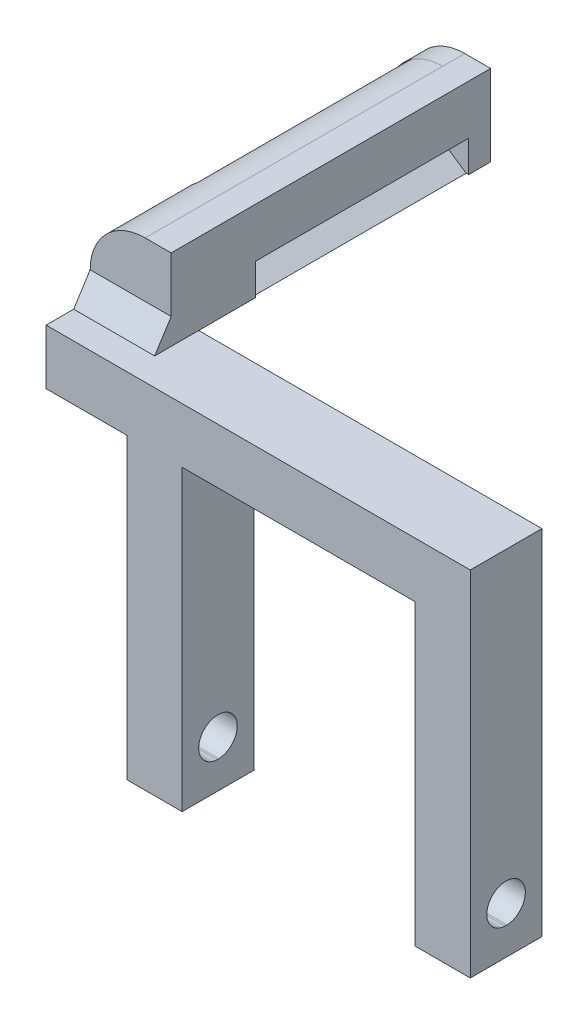
ISO-10303-21;
HEADER;
FILE_DESCRIPTION(('STEP AP214'),'2;1');
FILE_NAME('part.step','',(''),(''),'','','');
FILE_SCHEMA(('AUTOMOTIVE_DESIGN { 1 0 10303 214 1 1 1 1 }'));
ENDSEC;
DATA;
#1=APPLICATION_CONTEXT('core data for automotive mechanical design processes');
#2=APPLICATION_PROTOCOL_DEFINITION('international standard','automotive_design',2000,#1);
#3=PRODUCT_CONTEXT('',#1,'mechanical');
#4=PRODUCT('Part','Part','',(#3));
#5=PRODUCT_RELATED_PRODUCT_CATEGORY('part','',(#4));
#6=PRODUCT_DEFINITION_FORMATION('','',#4);
#7=PRODUCT_DEFINITION_CONTEXT('part definition',#1,'design');
#8=PRODUCT_DEFINITION('design','',#6,#7);
#9=PRODUCT_DEFINITION_SHAPE('','',#8);
#10=(LENGTH_UNIT() NAMED_UNIT(*) SI_UNIT(.MILLI.,.METRE.));
#11=(NAMED_UNIT(*) PLANE_ANGLE_UNIT() SI_UNIT($,.RADIAN.));
#12=(NAMED_UNIT(*) SI_UNIT($,.STERADIAN.) SOLID_ANGLE_UNIT());
#13=UNCERTAINTY_MEASURE_WITH_UNIT(LENGTH_MEASURE(1.E-05),#10,'distance_accuracy_value','');
#14=(GEOMETRIC_REPRESENTATION_CONTEXT(3) GLOBAL_UNCERTAINTY_ASSIGNED_CONTEXT((#13)) GLOBAL_UNIT_ASSIGNED_CONTEXT((#10,
#11,#12)) REPRESENTATION_CONTEXT('',''));
#15=CARTESIAN_POINT('',(0.,0.,0.));
#16=DIRECTION('',(0.,0.,1.));
#17=DIRECTION('',(1.,0.,0.));
#18=AXIS2_PLACEMENT_3D('',#15,#16,#17);
#19=CARTESIAN_POINT('',(-21.5,10.,5.));
#20=DIRECTION('',(0.,0.,-1.));
#21=DIRECTION('',(-1.,0.,0.));
#22=AXIS2_PLACEMENT_3D('',#19,#20,#21);
#23=PLANE('',#22);
#24=CARTESIAN_POINT('',(-36.2,14.7,5.));
#25=DIRECTION('',(0.,0.,-1.));
#26=DIRECTION('',(-1.,0.,0.));
#27=AXIS2_PLACEMENT_3D('',#24,#25,#26);
#28=CIRCLE('',#27,10.);
#29=CARTESIAN_POINT('',(-36.2,24.7,5.));
#30=VERTEX_POINT('',#29);
#31=CARTESIAN_POINT('',(-46.2,14.7,5.));
#32=VERTEX_POINT('',#31);
#33=EDGE_CURVE('E395',#30,#32,#28,.F.);
#34=ORIENTED_EDGE('',*,*,#33,.T.);
#35=DIRECTION('',(-1.,0.,0.));
#36=VECTOR('',#35,1.);
#37=CARTESIAN_POINT('',(-31.2,14.7,5.));
#38=LINE('',#37,#36);
#39=CARTESIAN_POINT('',(-31.5,14.7,5.));
#40=VERTEX_POINT('',#39);
#41=EDGE_CURVE('E304',#40,#32,#38,.T.);
#42=ORIENTED_EDGE('',*,*,#41,.F.);
#43=DIRECTION('',(0.,-1.,0.));
#44=VECTOR('',#43,1.);
#45=CARTESIAN_POINT('',(-31.5,24.7,5.));
#46=LINE('',#45,#44);
#47=CARTESIAN_POINT('',(-31.5,24.7,5.));
#48=VERTEX_POINT('',#47);
#49=EDGE_CURVE('E384',#48,#40,#46,.T.);
#50=ORIENTED_EDGE('',*,*,#49,.F.);
#51=DIRECTION('',(1.,0.,0.));
#52=VECTOR('',#51,1.);
#53=CARTESIAN_POINT('',(-46.2,24.7,5.));
#54=LINE('',#53,#52);
#55=EDGE_CURVE('E379',#30,#48,#54,.T.);
#56=ORIENTED_EDGE('',*,*,#55,.F.);
#57=EDGE_LOOP('',(#34,#42,#50,#56));
#58=FACE_BOUND('',#57,.T.);
#59=ADVANCED_FACE('F33',(#58),#23,.F.);
#60=CARTESIAN_POINT('',(0.,0.,0.));
#61=DIRECTION('',(0.,1.,0.));
#62=DIRECTION('',(0.,0.,1.));
#63=AXIS2_PLACEMENT_3D('',#60,#61,#62);
#64=PLANE('',#63);
#65=DIRECTION('',(0.,0.,1.));
#66=VECTOR('',#65,1.);
#67=CARTESIAN_POINT('',(-21.5,0.,-5.));
#68=LINE('',#67,#66);
#69=CARTESIAN_POINT('',(-21.5,0.,0.));
#70=VERTEX_POINT('',#69);
#71=CARTESIAN_POINT('',(-21.5,0.,13.));
#72=VERTEX_POINT('',#71);
#73=EDGE_CURVE('E215',#70,#72,#68,.T.);
#74=ORIENTED_EDGE('',*,*,#73,.F.);
#75=DIRECTION('',(1.,0.,0.));
#76=VECTOR('',#75,1.);
#77=CARTESIAN_POINT('',(0.,0.,0.));
#78=LINE('',#77,#76);
#79=CARTESIAN_POINT('',(20.8,0.,0.));
#80=VERTEX_POINT('',#79);
#81=EDGE_CURVE('E313',#70,#80,#78,.T.);
#82=ORIENTED_EDGE('',*,*,#81,.T.);
#83=DIRECTION('',(0.,0.,-1.));
#84=VECTOR('',#83,1.);
#85=CARTESIAN_POINT('',(20.8,0.,-5.));
#86=LINE('',#85,#84);
#87=CARTESIAN_POINT('',(20.8,0.,13.));
#88=VERTEX_POINT('',#87);
#89=EDGE_CURVE('E326',#88,#80,#86,.T.);
#90=ORIENTED_EDGE('',*,*,#89,.F.);
#91=DIRECTION('',(1.,0.,0.));
#92=VECTOR('',#91,1.);
#93=CARTESIAN_POINT('',(-21.5,0.,13.));
#94=LINE('',#93,#92);
#95=EDGE_CURVE('E219',#72,#88,#94,.T.);
#96=ORIENTED_EDGE('',*,*,#95,.F.);
#97=EDGE_LOOP('',(#74,#82,#90,#96));
#98=FACE_BOUND('',#97,.T.);
#99=ADVANCED_FACE('F449',(#98),#64,.F.);
#100=CARTESIAN_POINT('',(-31.5,24.7,-5.));
#101=DIRECTION('',(-1.,0.,0.));
#102=DIRECTION('',(0.,0.,1.));
#103=AXIS2_PLACEMENT_3D('',#100,#101,#102);
#104=PLANE('',#103);
#105=DIRECTION('',(0.,0.,1.));
#106=VECTOR('',#105,1.);
#107=CARTESIAN_POINT('',(-31.5,15.7251090794089,-5.));
#108=LINE('',#107,#106);
#109=CARTESIAN_POINT('',(-31.5,15.7251090794089,-49.));
#110=VERTEX_POINT('',#109);
#111=CARTESIAN_POINT('',(-31.5,15.7251090794089,-10.3));
#112=VERTEX_POINT('',#111);
#113=EDGE_CURVE('E340',#110,#112,#108,.T.);
#114=ORIENTED_EDGE('',*,*,#113,.F.);
#115=DIRECTION('',(0.,-1.,0.));
#116=VECTOR('',#115,1.);
#117=CARTESIAN_POINT('',(-31.5,24.7,-49.));
#118=LINE('',#117,#116);
#119=CARTESIAN_POINT('',(-31.5,10.,-49.));
#120=VERTEX_POINT('',#119);
#121=EDGE_CURVE('E343',#110,#120,#118,.T.);
#122=ORIENTED_EDGE('',*,*,#121,.T.);
#123=DIRECTION('',(0.,0.,1.));
#124=VECTOR('',#123,1.);
#125=CARTESIAN_POINT('',(-31.5,10.,-53.));
#126=LINE('',#125,#124);
#127=CARTESIAN_POINT('',(-31.5,10.,-53.));
#128=VERTEX_POINT('',#127);
#129=EDGE_CURVE('E354',#128,#120,#126,.T.);
#130=ORIENTED_EDGE('',*,*,#129,.F.);
#131=DIRECTION('',(0.,-1.,0.));
#132=VECTOR('',#131,1.);
#133=CARTESIAN_POINT('',(-31.5,24.7,-53.));
#134=LINE('',#133,#132);
#135=CARTESIAN_POINT('',(-31.5,24.7,-53.));
#136=VERTEX_POINT('',#135);
#137=EDGE_CURVE('E346',#136,#128,#134,.T.);
#138=ORIENTED_EDGE('',*,*,#137,.F.);
#139=DIRECTION('',(0.,0.,-1.));
#140=VECTOR('',#139,1.);
#141=CARTESIAN_POINT('',(-31.5,24.7,-5.));
#142=LINE('',#141,#140);
#143=EDGE_CURVE('E381',#48,#136,#142,.T.);
#144=ORIENTED_EDGE('',*,*,#143,.F.);
#145=ORIENTED_EDGE('',*,*,#49,.T.);
#146=DIRECTION('',(0.,-0.842922209577588,0.538035452921865));
#147=VECTOR('',#146,1.);
#148=CARTESIAN_POINT('',(-31.5,14.7,5.));
#149=LINE('',#148,#147);
#150=CARTESIAN_POINT('',(-31.5,10.,8.));
#151=VERTEX_POINT('',#150);
#152=EDGE_CURVE('E413',#40,#151,#149,.T.);
#153=ORIENTED_EDGE('',*,*,#152,.T.);
#154=DIRECTION('',(0.,0.,-1.));
#155=VECTOR('',#154,1.);
#156=CARTESIAN_POINT('',(-31.5,10.,-5.));
#157=LINE('',#156,#155);
#158=CARTESIAN_POINT('',(-31.5,10.,0.));
#159=VERTEX_POINT('',#158);
#160=EDGE_CURVE('E378',#151,#159,#157,.T.);
#161=ORIENTED_EDGE('',*,*,#160,.T.);
#162=DIRECTION('',(0.,0.,1.));
#163=VECTOR('',#162,1.);
#164=CARTESIAN_POINT('',(-31.5,10.,-19.7));
#165=LINE('',#164,#163);
#166=CARTESIAN_POINT('',(-31.5,10.,-10.3));
#167=VERTEX_POINT('',#166);
#168=EDGE_CURVE('E376',#167,#159,#165,.T.);
#169=ORIENTED_EDGE('',*,*,#168,.F.);
#170=DIRECTION('',(0.,-1.,0.));
#171=VECTOR('',#170,1.);
#172=CARTESIAN_POINT('',(-31.5,9.88,-10.3));
#173=LINE('',#172,#171);
#174=EDGE_CURVE('E369',#112,#167,#173,.T.);
#175=ORIENTED_EDGE('',*,*,#174,.F.);
#176=EDGE_LOOP('',(#114,#122,#130,#138,#144,#145,#153,#161,#169,#175));
#177=FACE_BOUND('',#176,.T.);
#178=ADVANCED_FACE('F455',(#177),#104,.F.);
#179=CARTESIAN_POINT('',(-36.2,14.7,0.));
#180=DIRECTION('',(0.,0.,1.));
#181=DIRECTION('',(1.,0.,0.));
#182=AXIS2_PLACEMENT_3D('',#179,#180,#181);
#183=CYLINDRICAL_SURFACE('',#182,10.);
#184=DIRECTION('',(0.,0.,1.));
#185=VECTOR('',#184,1.);
#186=CARTESIAN_POINT('',(-42.0560346654774,22.8059766837024,0.));
#187=LINE('',#186,#185);
#188=CARTESIAN_POINT('',(-42.0560346654774,22.8059766837024,-49.));
#189=VERTEX_POINT('',#188);
#190=CARTESIAN_POINT('',(-42.0560346654774,22.8059766837024,-10.3));
#191=VERTEX_POINT('',#190);
#192=EDGE_CURVE('E337',#189,#191,#187,.T.);
#193=ORIENTED_EDGE('',*,*,#192,.T.);
#194=CARTESIAN_POINT('',(-36.2,14.7,-10.3));
#195=DIRECTION('',(0.,0.,1.));
#196=DIRECTION('',(1.,0.,0.));
#197=AXIS2_PLACEMENT_3D('',#194,#195,#196);
#198=CIRCLE('',#197,10.);
#199=CARTESIAN_POINT('',(-45.2594042690637,18.9340517580292,-10.3));
#200=VERTEX_POINT('',#199);
#201=EDGE_CURVE('E364',#200,#191,#198,.F.);
#202=ORIENTED_EDGE('',*,*,#201,.F.);
#203=DIRECTION('',(0.,0.,1.));
#204=VECTOR('',#203,1.);
#205=CARTESIAN_POINT('',(-45.2594042690637,18.9340517580292,0.));
#206=LINE('',#205,#204);
#207=CARTESIAN_POINT('',(-45.2594042690637,18.9340517580292,-49.));
#208=VERTEX_POINT('',#207);
#209=EDGE_CURVE('E367',#208,#200,#206,.T.);
#210=ORIENTED_EDGE('',*,*,#209,.F.);
#211=CARTESIAN_POINT('',(-36.2,14.7,-49.));
#212=DIRECTION('',(0.,0.,-1.));
#213=DIRECTION('',(-1.,0.,0.));
#214=AXIS2_PLACEMENT_3D('',#211,#212,#213);
#215=CIRCLE('',#214,10.);
#216=CARTESIAN_POINT('',(-46.2,14.7,-49.));
#217=VERTEX_POINT('',#216);
#218=EDGE_CURVE('E401',#217,#208,#215,.T.);
#219=ORIENTED_EDGE('',*,*,#218,.F.);
#220=DIRECTION('',(0.,0.,1.));
#221=VECTOR('',#220,1.);
#222=CARTESIAN_POINT('',(-46.2,14.7,0.));
#223=LINE('',#222,#221);
#224=EDGE_CURVE('E398',#32,#217,#223,.F.);
#225=ORIENTED_EDGE('',*,*,#224,.F.);
#226=ORIENTED_EDGE('',*,*,#33,.F.);
#227=DIRECTION('',(0.,0.,1.));
#228=VECTOR('',#227,1.);
#229=CARTESIAN_POINT('',(-36.2,24.7,0.));
#230=LINE('',#229,#228);
#231=CARTESIAN_POINT('',(-36.2,24.7,-49.));
#232=VERTEX_POINT('',#231);
#233=EDGE_CURVE('E392',#232,#30,#230,.T.);
#234=ORIENTED_EDGE('',*,*,#233,.F.);
#235=EDGE_CURVE('E400',#189,#232,#215,.T.);
#236=ORIENTED_EDGE('',*,*,#235,.F.);
#237=EDGE_LOOP('',(#193,#202,#210,#219,#225,#226,#234,#236));
#238=FACE_BOUND('',#237,.T.);
#239=ADVANCED_FACE('F458',(#238),#183,.T.);
#240=CARTESIAN_POINT('',(-31.5,0.,0.));
#241=DIRECTION('',(1.,0.,0.));
#242=DIRECTION('',(0.,0.,-1.));
#243=AXIS2_PLACEMENT_3D('',#240,#241,#242);
#244=PLANE('',#243);
#245=DIRECTION('',(0.,-1.,0.));
#246=VECTOR('',#245,1.);
#247=CARTESIAN_POINT('',(-31.5,0.,0.));
#248=LINE('',#247,#246);
#249=CARTESIAN_POINT('',(-31.5,0.,0.));
#250=VERTEX_POINT('',#249);
#251=CARTESIAN_POINT('',(-31.5,-54.15,0.));
#252=VERTEX_POINT('',#251);
#253=EDGE_CURVE('E324',#250,#252,#248,.T.);
#254=ORIENTED_EDGE('',*,*,#253,.T.);
#255=DIRECTION('',(0.,0.,-1.));
#256=VECTOR('',#255,1.);
#257=CARTESIAN_POINT('',(-31.5,-54.15,13.));
#258=LINE('',#257,#256);
#259=CARTESIAN_POINT('',(-31.5,-54.15,13.));
#260=VERTEX_POINT('',#259);
#261=EDGE_CURVE('E231',#260,#252,#258,.T.);
#262=ORIENTED_EDGE('',*,*,#261,.F.);
#263=DIRECTION('',(0.,-1.,0.));
#264=VECTOR('',#263,1.);
#265=CARTESIAN_POINT('',(-31.5,0.,13.));
#266=LINE('',#265,#264);
#267=CARTESIAN_POINT('',(-31.5,0.,13.));
#268=VERTEX_POINT('',#267);
#269=EDGE_CURVE('E220',#268,#260,#266,.T.);
#270=ORIENTED_EDGE('',*,*,#269,.F.);
#271=DIRECTION('',(0.,0.,1.));
#272=VECTOR('',#271,1.);
#273=CARTESIAN_POINT('',(-31.5,0.,-5.));
#274=LINE('',#273,#272);
#275=EDGE_CURVE('E387',#250,#268,#274,.T.);
#276=ORIENTED_EDGE('',*,*,#275,.F.);
#277=EDGE_LOOP('',(#254,#262,#270,#276));
#278=FACE_BOUND('',#277,.T.);
#279=CARTESIAN_POINT('',(-31.5,-45.6537795556109,6.49999999999999));
#280=DIRECTION('',(1.,0.,0.));
#281=DIRECTION('',(0.,0.,-1.));
#282=AXIS2_PLACEMENT_3D('',#279,#280,#281);
#283=CIRCLE('',#282,3.5);
#284=CARTESIAN_POINT('',(-31.5,-49.15,6.66261182071307));
#285=VERTEX_POINT('',#284);
#286=CARTESIAN_POINT('',(-31.5,-49.15,6.33738817928692));
#287=VERTEX_POINT('',#286);
#288=EDGE_CURVE('E268',#285,#287,#283,.F.);
#289=ORIENTED_EDGE('',*,*,#288,.F.);
#290=DIRECTION('',(0.,0.,-1.));
#291=VECTOR('',#290,1.);
#292=CARTESIAN_POINT('',(-31.5,-49.15,13.));
#293=LINE('',#292,#291);
#294=EDGE_CURVE('E237',#285,#287,#293,.T.);
#295=ORIENTED_EDGE('',*,*,#294,.T.);
#296=EDGE_LOOP('',(#289,#295));
#297=FACE_BOUND('',#296,.T.);
#298=ADVANCED_FACE('F432',(#278,#297),#244,.F.);
#299=CARTESIAN_POINT('',(0.,10.,0.));
#300=DIRECTION('',(0.,1.,0.));
#301=DIRECTION('',(0.,0.,1.));
#302=AXIS2_PLACEMENT_3D('',#299,#300,#301);
#303=PLANE('',#302);
#304=ORIENTED_EDGE('',*,*,#160,.F.);
#305=DIRECTION('',(-1.,0.,0.));
#306=VECTOR('',#305,1.);
#307=CARTESIAN_POINT('',(-31.2,10.,8.));
#308=LINE('',#307,#306);
#309=CARTESIAN_POINT('',(-46.2,10.,8.));
#310=VERTEX_POINT('',#309);
#311=EDGE_CURVE('E303',#151,#310,#308,.T.);
#312=ORIENTED_EDGE('',*,*,#311,.T.);
#313=DIRECTION('',(0.,0.,-1.));
#314=VECTOR('',#313,1.);
#315=CARTESIAN_POINT('',(-46.2,10.,13.));
#316=LINE('',#315,#314);
#317=CARTESIAN_POINT('',(-46.2,10.,13.));
#318=VERTEX_POINT('',#317);
#319=EDGE_CURVE('E297',#318,#310,#316,.T.);
#320=ORIENTED_EDGE('',*,*,#319,.F.);
#321=DIRECTION('',(-1.,0.,0.));
#322=VECTOR('',#321,1.);
#323=CARTESIAN_POINT('',(30.8,10.,13.));
#324=LINE('',#323,#322);
#325=CARTESIAN_POINT('',(30.8,10.,13.));
#326=VERTEX_POINT('',#325);
#327=EDGE_CURVE('E283',#326,#318,#324,.T.);
#328=ORIENTED_EDGE('',*,*,#327,.F.);
#329=DIRECTION('',(0.,0.,1.));
#330=VECTOR('',#329,1.);
#331=CARTESIAN_POINT('',(30.8,10.,5.));
#332=LINE('',#331,#330);
#333=CARTESIAN_POINT('',(30.8,10.,0.));
#334=VERTEX_POINT('',#333);
#335=EDGE_CURVE('E329',#334,#326,#332,.T.);
#336=ORIENTED_EDGE('',*,*,#335,.F.);
#337=DIRECTION('',(1.,0.,0.));
#338=VECTOR('',#337,1.);
#339=CARTESIAN_POINT('',(-58.2,10.,0.));
#340=LINE('',#339,#338);
#341=EDGE_CURVE('E308',#159,#334,#340,.T.);
#342=ORIENTED_EDGE('',*,*,#341,.F.);
#343=EDGE_LOOP('',(#304,#312,#320,#328,#336,#342));
#344=FACE_BOUND('',#343,.T.);
#345=ADVANCED_FACE('F436',(#344),#303,.T.);
#346=CARTESIAN_POINT('',(-21.5,-43.18,-5.));
#347=DIRECTION('',(-1.,0.,0.));
#348=DIRECTION('',(0.,0.,1.));
#349=AXIS2_PLACEMENT_3D('',#346,#347,#348);
#350=PLANE('',#349);
#351=DIRECTION('',(0.,1.,0.));
#352=VECTOR('',#351,1.);
#353=CARTESIAN_POINT('',(-21.5,-49.15,13.));
#354=LINE('',#353,#352);
#355=CARTESIAN_POINT('',(-21.5,-54.15,13.));
#356=VERTEX_POINT('',#355);
#357=EDGE_CURVE('E207',#356,#72,#354,.T.);
#358=ORIENTED_EDGE('',*,*,#357,.F.);
#359=DIRECTION('',(0.,0.,1.));
#360=VECTOR('',#359,1.);
#361=CARTESIAN_POINT('',(-21.5,-54.15,13.));
#362=LINE('',#361,#360);
#363=CARTESIAN_POINT('',(-21.5,-54.15,0.));
#364=VERTEX_POINT('',#363);
#365=EDGE_CURVE('E213',#364,#356,#362,.T.);
#366=ORIENTED_EDGE('',*,*,#365,.F.);
#367=DIRECTION('',(0.,1.,0.));
#368=VECTOR('',#367,1.);
#369=CARTESIAN_POINT('',(-21.5,-43.18,0.));
#370=LINE('',#369,#368);
#371=EDGE_CURVE('E316',#364,#70,#370,.T.);
#372=ORIENTED_EDGE('',*,*,#371,.T.);
#373=ORIENTED_EDGE('',*,*,#73,.T.);
#374=EDGE_LOOP('',(#358,#366,#372,#373));
#375=FACE_BOUND('',#374,.T.);
#376=CARTESIAN_POINT('',(-21.5,-45.6537795556109,6.49999999999999));
#377=DIRECTION('',(-1.,0.,0.));
#378=DIRECTION('',(0.,0.,1.));
#379=AXIS2_PLACEMENT_3D('',#376,#377,#378);
#380=CIRCLE('',#379,3.5);
#381=CARTESIAN_POINT('',(-21.5,-49.15,6.33738817928692));
#382=VERTEX_POINT('',#381);
#383=CARTESIAN_POINT('',(-21.5,-49.15,6.66261182071307));
#384=VERTEX_POINT('',#383);
#385=EDGE_CURVE('E261',#382,#384,#380,.F.);
#386=ORIENTED_EDGE('',*,*,#385,.F.);
#387=DIRECTION('',(0.,0.,1.));
#388=VECTOR('',#387,1.);
#389=CARTESIAN_POINT('',(-21.5,-49.15,13.));
#390=LINE('',#389,#388);
#391=EDGE_CURVE('E240',#382,#384,#390,.T.);
#392=ORIENTED_EDGE('',*,*,#391,.T.);
#393=EDGE_LOOP('',(#386,#392));
#394=FACE_BOUND('',#393,.T.);
#395=ADVANCED_FACE('F209',(#375,#394),#350,.F.);
#396=CARTESIAN_POINT('',(-46.2,0.,-5.));
#397=DIRECTION('',(0.,1.,0.));
#398=DIRECTION('',(0.,0.,1.));
#399=AXIS2_PLACEMENT_3D('',#396,#397,#398);
#400=PLANE('',#399);
#401=DIRECTION('',(0.,0.,1.));
#402=VECTOR('',#401,1.);
#403=CARTESIAN_POINT('',(-46.2,0.,-5.));
#404=LINE('',#403,#402);
#405=CARTESIAN_POINT('',(-46.2,0.,0.));
#406=VERTEX_POINT('',#405);
#407=CARTESIAN_POINT('',(-46.2,0.,13.));
#408=VERTEX_POINT('',#407);
#409=EDGE_CURVE('E388',#406,#408,#404,.T.);
#410=ORIENTED_EDGE('',*,*,#409,.F.);
#411=DIRECTION('',(1.,0.,0.));
#412=VECTOR('',#411,1.);
#413=CARTESIAN_POINT('',(-46.2,0.,0.));
#414=LINE('',#413,#412);
#415=EDGE_CURVE('E321',#406,#250,#414,.T.);
#416=ORIENTED_EDGE('',*,*,#415,.T.);
#417=ORIENTED_EDGE('',*,*,#275,.T.);
#418=DIRECTION('',(1.,0.,0.));
#419=VECTOR('',#418,1.);
#420=CARTESIAN_POINT('',(-46.2,0.,13.));
#421=LINE('',#420,#419);
#422=EDGE_CURVE('E288',#408,#268,#421,.T.);
#423=ORIENTED_EDGE('',*,*,#422,.F.);
#424=EDGE_LOOP('',(#410,#416,#417,#423));
#425=FACE_BOUND('',#424,.T.);
#426=ADVANCED_FACE('F435',(#425),#400,.F.);
#427=CARTESIAN_POINT('',(-46.2,0.,0.));
#428=DIRECTION('',(-1.,0.,0.));
#429=DIRECTION('',(0.,0.,1.));
#430=AXIS2_PLACEMENT_3D('',#427,#428,#429);
#431=PLANE('',#430);
#432=DIRECTION('',(0.,0.842922209577588,-0.538035452921865));
#433=VECTOR('',#432,1.);
#434=CARTESIAN_POINT('',(-46.2,14.7,5.));
#435=LINE('',#434,#433);
#436=EDGE_CURVE('E300',#310,#32,#435,.T.);
#437=ORIENTED_EDGE('',*,*,#436,.T.);
#438=ORIENTED_EDGE('',*,*,#224,.T.);
#439=DIRECTION('',(0.,0.,1.));
#440=VECTOR('',#439,1.);
#441=CARTESIAN_POINT('',(-46.2,14.7,0.));
#442=LINE('',#441,#440);
#443=CARTESIAN_POINT('',(-46.2,14.7,-53.));
#444=VERTEX_POINT('',#443);
#445=EDGE_CURVE('E48',#217,#444,#442,.F.);
#446=ORIENTED_EDGE('',*,*,#445,.T.);
#447=DIRECTION('',(0.,1.,0.));
#448=VECTOR('',#447,1.);
#449=CARTESIAN_POINT('',(-46.2,10.,-53.));
#450=LINE('',#449,#448);
#451=CARTESIAN_POINT('',(-46.2,10.,-53.));
#452=VERTEX_POINT('',#451);
#453=EDGE_CURVE('E352',#452,#444,#450,.T.);
#454=ORIENTED_EDGE('',*,*,#453,.F.);
#455=DIRECTION('',(0.,0.,1.));
#456=VECTOR('',#455,1.);
#457=CARTESIAN_POINT('',(-46.2,10.,-19.7));
#458=LINE('',#457,#456);
#459=CARTESIAN_POINT('',(-46.2,10.,0.));
#460=VERTEX_POINT('',#459);
#461=EDGE_CURVE('E374',#452,#460,#458,.T.);
#462=ORIENTED_EDGE('',*,*,#461,.T.);
#463=DIRECTION('',(0.,1.,0.));
#464=VECTOR('',#463,1.);
#465=CARTESIAN_POINT('',(-46.2,0.,0.));
#466=LINE('',#465,#464);
#467=EDGE_CURVE('E318',#406,#460,#466,.T.);
#468=ORIENTED_EDGE('',*,*,#467,.F.);
#469=ORIENTED_EDGE('',*,*,#409,.T.);
#470=DIRECTION('',(0.,-1.,0.));
#471=VECTOR('',#470,1.);
#472=CARTESIAN_POINT('',(-46.2,10.,13.));
#473=LINE('',#472,#471);
#474=EDGE_CURVE('E285',#318,#408,#473,.T.);
#475=ORIENTED_EDGE('',*,*,#474,.F.);
#476=ORIENTED_EDGE('',*,*,#319,.T.);
#477=EDGE_LOOP('',(#437,#438,#446,#454,#462,#468,#469,#475,#476));
#478=FACE_BOUND('',#477,.T.);
#479=ADVANCED_FACE('F442',(#478),#431,.T.);
#480=CARTESIAN_POINT('',(0.,24.7,0.));
#481=DIRECTION('',(0.,1.,0.));
#482=DIRECTION('',(0.,0.,1.));
#483=AXIS2_PLACEMENT_3D('',#480,#481,#482);
#484=PLANE('',#483);
#485=DIRECTION('',(1.,0.,0.));
#486=VECTOR('',#485,1.);
#487=CARTESIAN_POINT('',(-46.2,24.7,-53.));
#488=LINE('',#487,#486);
#489=CARTESIAN_POINT('',(-36.2,24.7,-53.));
#490=VERTEX_POINT('',#489);
#491=EDGE_CURVE('E344',#490,#136,#488,.T.);
#492=ORIENTED_EDGE('',*,*,#491,.F.);
#493=DIRECTION('',(0.,0.,1.));
#494=VECTOR('',#493,1.);
#495=CARTESIAN_POINT('',(-36.2,24.7,0.));
#496=LINE('',#495,#494);
#497=EDGE_CURVE('E408',#490,#232,#496,.T.);
#498=ORIENTED_EDGE('',*,*,#497,.T.);
#499=ORIENTED_EDGE('',*,*,#233,.T.);
#500=ORIENTED_EDGE('',*,*,#55,.T.);
#501=ORIENTED_EDGE('',*,*,#143,.T.);
#502=EDGE_LOOP('',(#492,#498,#499,#500,#501));
#503=FACE_BOUND('',#502,.T.);
#504=ADVANCED_FACE('F525',(#503),#484,.T.);
#505=CARTESIAN_POINT('',(-31.5,10.,-19.7));
#506=DIRECTION('',(0.,1.,0.));
#507=DIRECTION('',(0.,0.,1.));
#508=AXIS2_PLACEMENT_3D('',#505,#506,#507);
#509=PLANE('',#508);
#510=DIRECTION('',(0.,0.,1.));
#511=VECTOR('',#510,1.);
#512=CARTESIAN_POINT('',(-31.9406747953279,10.,-19.7));
#513=LINE('',#512,#511);
#514=CARTESIAN_POINT('',(-31.9406747953279,10.,-49.));
#515=VERTEX_POINT('',#514);
#516=CARTESIAN_POINT('',(-31.9406747953279,10.,-10.3));
#517=VERTEX_POINT('',#516);
#518=EDGE_CURVE('E371',#515,#517,#513,.T.);
#519=ORIENTED_EDGE('',*,*,#518,.T.);
#520=DIRECTION('',(-1.,0.,0.));
#521=VECTOR('',#520,1.);
#522=CARTESIAN_POINT('',(-31.5,10.,-10.3));
#523=LINE('',#522,#521);
#524=EDGE_CURVE('E404',#167,#517,#523,.T.);
#525=ORIENTED_EDGE('',*,*,#524,.F.);
#526=ORIENTED_EDGE('',*,*,#168,.T.);
#527=EDGE_CURVE('E310',#460,#159,#340,.T.);
#528=ORIENTED_EDGE('',*,*,#527,.F.);
#529=ORIENTED_EDGE('',*,*,#461,.F.);
#530=DIRECTION('',(-1.,0.,0.));
#531=VECTOR('',#530,1.);
#532=CARTESIAN_POINT('',(-31.5,10.,-53.));
#533=LINE('',#532,#531);
#534=EDGE_CURVE('E349',#128,#452,#533,.T.);
#535=ORIENTED_EDGE('',*,*,#534,.F.);
#536=ORIENTED_EDGE('',*,*,#129,.T.);
#537=DIRECTION('',(-1.,0.,0.));
#538=VECTOR('',#537,1.);
#539=CARTESIAN_POINT('',(-31.5,10.,-49.));
#540=LINE('',#539,#538);
#541=EDGE_CURVE('E347',#120,#515,#540,.T.);
#542=ORIENTED_EDGE('',*,*,#541,.T.);
#543=EDGE_LOOP('',(#519,#525,#526,#528,#529,#535,#536,#542));
#544=FACE_BOUND('',#543,.T.);
#545=ADVANCED_FACE('F486',(#544),#509,.F.);
#546=CARTESIAN_POINT('',(0.,0.,-10.3));
#547=DIRECTION('',(0.,0.,-1.));
#548=DIRECTION('',(-1.,0.,0.));
#549=AXIS2_PLACEMENT_3D('',#546,#547,#548);
#550=PLANE('',#549);
#551=DIRECTION('',(0.830467017418905,-0.557067799266254,0.));
#552=VECTOR('',#551,1.);
#553=CARTESIAN_POINT('',(-29.1553357989966,14.1523350870945,-10.3));
#554=LINE('',#553,#552);
#555=EDGE_CURVE('E334',#191,#112,#554,.T.);
#556=ORIENTED_EDGE('',*,*,#555,.T.);
#557=ORIENTED_EDGE('',*,*,#174,.T.);
#558=ORIENTED_EDGE('',*,*,#524,.T.);
#559=DIRECTION('',(0.830467017418905,-0.557067799266254,0.));
#560=VECTOR('',#559,1.);
#561=CARTESIAN_POINT('',(-48.5755901414839,21.1585114020117,-10.3));
#562=LINE('',#561,#560);
#563=EDGE_CURVE('E360',#200,#517,#562,.T.);
#564=ORIENTED_EDGE('',*,*,#563,.F.);
#565=ORIENTED_EDGE('',*,*,#201,.T.);
#566=EDGE_LOOP('',(#556,#557,#558,#564,#565));
#567=FACE_BOUND('',#566,.T.);
#568=ADVANCED_FACE('F533',(#567),#550,.T.);
#569=CARTESIAN_POINT('',(-48.5755901414839,21.1585114020117,-10.3));
#570=DIRECTION('',(-0.557067799266254,-0.830467017418905,0.));
#571=DIRECTION('',(0.830467017418905,-0.557067799266254,0.));
#572=AXIS2_PLACEMENT_3D('',#569,#570,#571);
#573=PLANE('',#572);
#574=ORIENTED_EDGE('',*,*,#209,.T.);
#575=ORIENTED_EDGE('',*,*,#563,.T.);
#576=ORIENTED_EDGE('',*,*,#518,.F.);
#577=DIRECTION('',(0.830467017418905,-0.557067799266254,0.));
#578=VECTOR('',#577,1.);
#579=CARTESIAN_POINT('',(-48.5755901414839,21.1585114020117,-49.));
#580=LINE('',#579,#578);
#581=EDGE_CURVE('E361',#208,#515,#580,.T.);
#582=ORIENTED_EDGE('',*,*,#581,.F.);
#583=EDGE_LOOP('',(#574,#575,#576,#582));
#584=FACE_BOUND('',#583,.T.);
#585=ADVANCED_FACE('F539',(#584),#573,.F.);
#586=CARTESIAN_POINT('',(0.,0.,-53.));
#587=DIRECTION('',(0.,0.,-1.));
#588=DIRECTION('',(-1.,0.,0.));
#589=AXIS2_PLACEMENT_3D('',#586,#587,#588);
#590=PLANE('',#589);
#591=ORIENTED_EDGE('',*,*,#453,.T.);
#592=CARTESIAN_POINT('',(-36.2,14.7,-53.));
#593=DIRECTION('',(0.,0.,-1.));
#594=DIRECTION('',(-1.,0.,0.));
#595=AXIS2_PLACEMENT_3D('',#592,#593,#594);
#596=CIRCLE('',#595,10.);
#597=EDGE_CURVE('E55',#444,#490,#596,.T.);
#598=ORIENTED_EDGE('',*,*,#597,.T.);
#599=ORIENTED_EDGE('',*,*,#491,.T.);
#600=ORIENTED_EDGE('',*,*,#137,.T.);
#601=ORIENTED_EDGE('',*,*,#534,.T.);
#602=EDGE_LOOP('',(#591,#598,#599,#600,#601));
#603=FACE_BOUND('',#602,.T.);
#604=ADVANCED_FACE('F488',(#603),#590,.T.);
#605=CARTESIAN_POINT('',(0.,0.,-49.));
#606=DIRECTION('',(0.,0.,-1.));
#607=DIRECTION('',(-1.,0.,0.));
#608=AXIS2_PLACEMENT_3D('',#605,#606,#607);
#609=PLANE('',#608);
#610=DIRECTION('',(-0.830467017418905,0.557067799266254,0.));
#611=VECTOR('',#610,1.);
#612=CARTESIAN_POINT('',(-42.4740652727325,23.0863868451237,-49.));
#613=LINE('',#612,#611);
#614=EDGE_CURVE('E331',#110,#189,#613,.T.);
#615=ORIENTED_EDGE('',*,*,#614,.T.);
#616=EDGE_CURVE('E405',#208,#189,#215,.T.);
#617=ORIENTED_EDGE('',*,*,#616,.F.);
#618=ORIENTED_EDGE('',*,*,#581,.T.);
#619=ORIENTED_EDGE('',*,*,#541,.F.);
#620=ORIENTED_EDGE('',*,*,#121,.F.);
#621=EDGE_LOOP('',(#615,#617,#618,#619,#620));
#622=FACE_BOUND('',#621,.T.);
#623=ADVANCED_FACE('F479',(#622),#609,.F.);
#624=CARTESIAN_POINT('',(-2.50037165500649,-3.72751071504592,0.));
#625=DIRECTION('',(-0.557067799266254,-0.830467017418905,0.));
#626=DIRECTION('',(0.830467017418905,-0.557067799266254,0.));
#627=AXIS2_PLACEMENT_3D('',#624,#625,#626);
#628=PLANE('',#627);
#629=ORIENTED_EDGE('',*,*,#113,.T.);
#630=ORIENTED_EDGE('',*,*,#555,.F.);
#631=ORIENTED_EDGE('',*,*,#192,.F.);
#632=ORIENTED_EDGE('',*,*,#614,.F.);
#633=EDGE_LOOP('',(#629,#630,#631,#632));
#634=FACE_BOUND('',#633,.T.);
#635=ADVANCED_FACE('F476',(#634),#628,.T.);
#636=CARTESIAN_POINT('',(-36.2,14.7,0.));
#637=DIRECTION('',(0.,0.,1.));
#638=DIRECTION('',(1.,0.,0.));
#639=AXIS2_PLACEMENT_3D('',#636,#637,#638);
#640=CYLINDRICAL_SURFACE('',#639,10.);
#641=ORIENTED_EDGE('',*,*,#597,.F.);
#642=ORIENTED_EDGE('',*,*,#445,.F.);
#643=ORIENTED_EDGE('',*,*,#218,.T.);
#644=ORIENTED_EDGE('',*,*,#616,.T.);
#645=ORIENTED_EDGE('',*,*,#235,.T.);
#646=ORIENTED_EDGE('',*,*,#497,.F.);
#647=EDGE_LOOP('',(#641,#642,#643,#644,#645,#646));
#648=FACE_BOUND('',#647,.T.);
#649=ADVANCED_FACE('F35',(#648),#640,.T.);
#650=CARTESIAN_POINT('',(30.8,0.,0.));
#651=DIRECTION('',(1.,0.,0.));
#652=DIRECTION('',(0.,0.,-1.));
#653=AXIS2_PLACEMENT_3D('',#650,#651,#652);
#654=PLANE('',#653);
#655=CARTESIAN_POINT('',(30.8,-45.6537795556109,6.49999999999999));
#656=DIRECTION('',(1.,0.,0.));
#657=DIRECTION('',(0.,0.,-1.));
#658=AXIS2_PLACEMENT_3D('',#655,#656,#657);
#659=CIRCLE('',#658,3.5);
#660=CARTESIAN_POINT('',(30.8,-49.15,6.66261182071307));
#661=VERTEX_POINT('',#660);
#662=CARTESIAN_POINT('',(30.8,-49.15,6.33738817928692));
#663=VERTEX_POINT('',#662);
#664=EDGE_CURVE('E277',#661,#663,#659,.F.);
#665=ORIENTED_EDGE('',*,*,#664,.T.);
#666=DIRECTION('',(0.,0.,1.));
#667=VECTOR('',#666,1.);
#668=CARTESIAN_POINT('',(30.8,-49.15,13.));
#669=LINE('',#668,#667);
#670=EDGE_CURVE('E245',#663,#661,#669,.T.);
#671=ORIENTED_EDGE('',*,*,#670,.T.);
#672=EDGE_LOOP('',(#665,#671));
#673=FACE_BOUND('',#672,.T.);
#674=DIRECTION('',(0.,1.,0.));
#675=VECTOR('',#674,1.);
#676=CARTESIAN_POINT('',(30.8,-49.15,13.));
#677=LINE('',#676,#675);
#678=CARTESIAN_POINT('',(30.8,-54.15,13.));
#679=VERTEX_POINT('',#678);
#680=EDGE_CURVE('E294',#679,#326,#677,.T.);
#681=ORIENTED_EDGE('',*,*,#680,.F.);
#682=DIRECTION('',(0.,0.,1.));
#683=VECTOR('',#682,1.);
#684=CARTESIAN_POINT('',(30.8,-54.15,13.));
#685=LINE('',#684,#683);
#686=CARTESIAN_POINT('',(30.8,-54.15,0.));
#687=VERTEX_POINT('',#686);
#688=EDGE_CURVE('E248',#687,#679,#685,.T.);
#689=ORIENTED_EDGE('',*,*,#688,.F.);
#690=DIRECTION('',(0.,-1.,0.));
#691=VECTOR('',#690,1.);
#692=CARTESIAN_POINT('',(30.8,-42.15,0.));
#693=LINE('',#692,#691);
#694=EDGE_CURVE('E306',#334,#687,#693,.T.);
#695=ORIENTED_EDGE('',*,*,#694,.F.);
#696=ORIENTED_EDGE('',*,*,#335,.T.);
#697=EDGE_LOOP('',(#681,#689,#695,#696));
#698=FACE_BOUND('',#697,.T.);
#699=ADVANCED_FACE('F505',(#673,#698),#654,.T.);
#700=CARTESIAN_POINT('',(20.8,-42.15,-5.));
#701=DIRECTION('',(1.,0.,0.));
#702=DIRECTION('',(0.,0.,-1.));
#703=AXIS2_PLACEMENT_3D('',#700,#701,#702);
#704=PLANE('',#703);
#705=DIRECTION('',(0.,-1.,0.));
#706=VECTOR('',#705,1.);
#707=CARTESIAN_POINT('',(20.8,-42.15,0.));
#708=LINE('',#707,#706);
#709=CARTESIAN_POINT('',(20.8,-54.15,0.));
#710=VERTEX_POINT('',#709);
#711=EDGE_CURVE('E311',#80,#710,#708,.T.);
#712=ORIENTED_EDGE('',*,*,#711,.T.);
#713=DIRECTION('',(0.,0.,-1.));
#714=VECTOR('',#713,1.);
#715=CARTESIAN_POINT('',(20.8,-54.15,13.));
#716=LINE('',#715,#714);
#717=CARTESIAN_POINT('',(20.8,-54.15,13.));
#718=VERTEX_POINT('',#717);
#719=EDGE_CURVE('E255',#718,#710,#716,.T.);
#720=ORIENTED_EDGE('',*,*,#719,.F.);
#721=DIRECTION('',(0.,-1.,0.));
#722=VECTOR('',#721,1.);
#723=CARTESIAN_POINT('',(20.8,0.,13.));
#724=LINE('',#723,#722);
#725=EDGE_CURVE('E292',#88,#718,#724,.T.);
#726=ORIENTED_EDGE('',*,*,#725,.F.);
#727=ORIENTED_EDGE('',*,*,#89,.T.);
#728=EDGE_LOOP('',(#712,#720,#726,#727));
#729=FACE_BOUND('',#728,.T.);
#730=CARTESIAN_POINT('',(20.8,-45.6537795556109,6.49999999999999));
#731=DIRECTION('',(1.,0.,0.));
#732=DIRECTION('',(0.,0.,-1.));
#733=AXIS2_PLACEMENT_3D('',#730,#731,#732);
#734=CIRCLE('',#733,3.5);
#735=CARTESIAN_POINT('',(20.8,-49.15,6.66261182071307));
#736=VERTEX_POINT('',#735);
#737=CARTESIAN_POINT('',(20.8,-49.15,6.33738817928692));
#738=VERTEX_POINT('',#737);
#739=EDGE_CURVE('E274',#736,#738,#734,.F.);
#740=ORIENTED_EDGE('',*,*,#739,.F.);
#741=DIRECTION('',(0.,0.,-1.));
#742=VECTOR('',#741,1.);
#743=CARTESIAN_POINT('',(20.8,-49.15,13.));
#744=LINE('',#743,#742);
#745=EDGE_CURVE('E252',#736,#738,#744,.T.);
#746=ORIENTED_EDGE('',*,*,#745,.T.);
#747=EDGE_LOOP('',(#740,#746));
#748=FACE_BOUND('',#747,.T.);
#749=ADVANCED_FACE('F512',(#729,#748),#704,.F.);
#750=CARTESIAN_POINT('',(-58.2,-42.15,0.));
#751=DIRECTION('',(0.,0.,1.));
#752=DIRECTION('',(1.,0.,0.));
#753=AXIS2_PLACEMENT_3D('',#750,#751,#752);
#754=PLANE('',#753);
#755=ORIENTED_EDGE('',*,*,#415,.F.);
#756=ORIENTED_EDGE('',*,*,#467,.T.);
#757=ORIENTED_EDGE('',*,*,#527,.T.);
#758=ORIENTED_EDGE('',*,*,#341,.T.);
#759=ORIENTED_EDGE('',*,*,#694,.T.);
#760=DIRECTION('',(1.,0.,0.));
#761=VECTOR('',#760,1.);
#762=CARTESIAN_POINT('',(30.8,-54.15,0.));
#763=LINE('',#762,#761);
#764=EDGE_CURVE('E258',#710,#687,#763,.T.);
#765=ORIENTED_EDGE('',*,*,#764,.F.);
#766=ORIENTED_EDGE('',*,*,#711,.F.);
#767=ORIENTED_EDGE('',*,*,#81,.F.);
#768=ORIENTED_EDGE('',*,*,#371,.F.);
#769=DIRECTION('',(1.,0.,0.));
#770=VECTOR('',#769,1.);
#771=CARTESIAN_POINT('',(-21.5,-54.15,0.));
#772=LINE('',#771,#770);
#773=EDGE_CURVE('E236',#252,#364,#772,.T.);
#774=ORIENTED_EDGE('',*,*,#773,.F.);
#775=ORIENTED_EDGE('',*,*,#253,.F.);
#776=EDGE_LOOP('',(#755,#756,#757,#758,#759,#765,#766,#767,#768,#774,#775));
#777=FACE_BOUND('',#776,.T.);
#778=ADVANCED_FACE('F493',(#777),#754,.F.);
#779=CARTESIAN_POINT('',(-31.2,14.7,5.));
#780=DIRECTION('',(0.,0.538035452921865,0.842922209577588));
#781=DIRECTION('',(0.,-0.842922209577588,0.538035452921865));
#782=AXIS2_PLACEMENT_3D('',#779,#780,#781);
#783=PLANE('',#782);
#784=ORIENTED_EDGE('',*,*,#152,.F.);
#785=ORIENTED_EDGE('',*,*,#41,.T.);
#786=ORIENTED_EDGE('',*,*,#436,.F.);
#787=ORIENTED_EDGE('',*,*,#311,.F.);
#788=EDGE_LOOP('',(#784,#785,#786,#787));
#789=FACE_BOUND('',#788,.T.);
#790=ADVANCED_FACE('F557',(#789),#783,.T.);
#791=CARTESIAN_POINT('',(0.,0.,13.));
#792=DIRECTION('',(0.,0.,1.));
#793=DIRECTION('',(1.,0.,0.));
#794=AXIS2_PLACEMENT_3D('',#791,#792,#793);
#795=PLANE('',#794);
#796=ORIENTED_EDGE('',*,*,#327,.T.);
#797=ORIENTED_EDGE('',*,*,#474,.T.);
#798=ORIENTED_EDGE('',*,*,#422,.T.);
#799=ORIENTED_EDGE('',*,*,#269,.T.);
#800=DIRECTION('',(-1.,0.,0.));
#801=VECTOR('',#800,1.);
#802=CARTESIAN_POINT('',(-21.5,-54.15,13.));
#803=LINE('',#802,#801);
#804=EDGE_CURVE('E223',#356,#260,#803,.T.);
#805=ORIENTED_EDGE('',*,*,#804,.F.);
#806=ORIENTED_EDGE('',*,*,#357,.T.);
#807=ORIENTED_EDGE('',*,*,#95,.T.);
#808=ORIENTED_EDGE('',*,*,#725,.T.);
#809=DIRECTION('',(-1.,0.,0.));
#810=VECTOR('',#809,1.);
#811=CARTESIAN_POINT('',(30.8,-54.15,13.));
#812=LINE('',#811,#810);
#813=EDGE_CURVE('E251',#679,#718,#812,.T.);
#814=ORIENTED_EDGE('',*,*,#813,.F.);
#815=ORIENTED_EDGE('',*,*,#680,.T.);
#816=EDGE_LOOP('',(#796,#797,#798,#799,#805,#806,#807,#808,#814,#815));
#817=FACE_BOUND('',#816,.T.);
#818=ADVANCED_FACE('F225',(#817),#795,.T.);
#819=CARTESIAN_POINT('',(53.5,-45.6537795556109,6.49999999999999));
#820=DIRECTION('',(-1.,0.,0.));
#821=DIRECTION('',(0.,0.,1.));
#822=AXIS2_PLACEMENT_3D('',#819,#820,#821);
#823=CYLINDRICAL_SURFACE('',#822,3.5);
#824=DIRECTION('',(-1.,0.,0.));
#825=VECTOR('',#824,1.);
#826=CARTESIAN_POINT('',(53.5,-49.15,6.33738817928692));
#827=LINE('',#826,#825);
#828=EDGE_CURVE('E11',#287,#382,#827,.F.);
#829=ORIENTED_EDGE('',*,*,#828,.T.);
#830=ORIENTED_EDGE('',*,*,#385,.T.);
#831=DIRECTION('',(-1.,0.,0.));
#832=VECTOR('',#831,1.);
#833=CARTESIAN_POINT('',(53.5,-49.15,6.66261182071307));
#834=LINE('',#833,#832);
#835=EDGE_CURVE('E41',#384,#285,#834,.T.);
#836=ORIENTED_EDGE('',*,*,#835,.T.);
#837=ORIENTED_EDGE('',*,*,#288,.T.);
#838=EDGE_LOOP('',(#829,#830,#836,#837));
#839=FACE_BOUND('',#838,.T.);
#840=ADVANCED_FACE('F428',(#839),#823,.F.);
#841=DIRECTION('',(-1.,0.,0.));
#842=VECTOR('',#841,1.);
#843=CARTESIAN_POINT('',(53.5,-49.15,6.33738817928692));
#844=LINE('',#843,#842);
#845=EDGE_CURVE('E280',#738,#663,#844,.F.);
#846=ORIENTED_EDGE('',*,*,#845,.T.);
#847=ORIENTED_EDGE('',*,*,#664,.F.);
#848=DIRECTION('',(-1.,0.,0.));
#849=VECTOR('',#848,1.);
#850=CARTESIAN_POINT('',(53.5,-49.15,6.66261182071307));
#851=LINE('',#850,#849);
#852=EDGE_CURVE('E271',#661,#736,#851,.T.);
#853=ORIENTED_EDGE('',*,*,#852,.T.);
#854=ORIENTED_EDGE('',*,*,#739,.T.);
#855=EDGE_LOOP('',(#846,#847,#853,#854));
#856=FACE_BOUND('',#855,.T.);
#857=ADVANCED_FACE('F562',(#856),#823,.F.);
#858=CARTESIAN_POINT('',(0.,-54.15,0.));
#859=DIRECTION('',(0.,1.,0.));
#860=DIRECTION('',(0.,0.,1.));
#861=AXIS2_PLACEMENT_3D('',#858,#859,#860);
#862=PLANE('',#861);
#863=ORIENTED_EDGE('',*,*,#688,.T.);
#864=ORIENTED_EDGE('',*,*,#813,.T.);
#865=ORIENTED_EDGE('',*,*,#719,.T.);
#866=ORIENTED_EDGE('',*,*,#764,.T.);
#867=EDGE_LOOP('',(#863,#864,#865,#866));
#868=FACE_BOUND('',#867,.T.);
#869=ADVANCED_FACE('F508',(#868),#862,.F.);
#870=CARTESIAN_POINT('',(0.,-49.15,0.));
#871=DIRECTION('',(0.,1.,0.));
#872=DIRECTION('',(0.,0.,1.));
#873=AXIS2_PLACEMENT_3D('',#870,#871,#872);
#874=PLANE('',#873);
#875=ORIENTED_EDGE('',*,*,#670,.F.);
#876=ORIENTED_EDGE('',*,*,#845,.F.);
#877=ORIENTED_EDGE('',*,*,#745,.F.);
#878=ORIENTED_EDGE('',*,*,#852,.F.);
#879=EDGE_LOOP('',(#875,#876,#877,#878));
#880=FACE_BOUND('',#879,.T.);
#881=ADVANCED_FACE('F566',(#880),#874,.T.);
#882=CARTESIAN_POINT('',(0.,-54.15,0.));
#883=DIRECTION('',(0.,1.,0.));
#884=DIRECTION('',(0.,0.,1.));
#885=AXIS2_PLACEMENT_3D('',#882,#883,#884);
#886=PLANE('',#885);
#887=ORIENTED_EDGE('',*,*,#365,.T.);
#888=ORIENTED_EDGE('',*,*,#804,.T.);
#889=ORIENTED_EDGE('',*,*,#261,.T.);
#890=ORIENTED_EDGE('',*,*,#773,.T.);
#891=EDGE_LOOP('',(#887,#888,#889,#890));
#892=FACE_BOUND('',#891,.T.);
#893=ADVANCED_FACE('F234',(#892),#886,.F.);
#894=CARTESIAN_POINT('',(0.,-49.15,0.));
#895=DIRECTION('',(0.,1.,0.));
#896=DIRECTION('',(0.,0.,1.));
#897=AXIS2_PLACEMENT_3D('',#894,#895,#896);
#898=PLANE('',#897);
#899=ORIENTED_EDGE('',*,*,#391,.F.);
#900=ORIENTED_EDGE('',*,*,#828,.F.);
#901=ORIENTED_EDGE('',*,*,#294,.F.);
#902=ORIENTED_EDGE('',*,*,#835,.F.);
#903=EDGE_LOOP('',(#899,#900,#901,#902));
#904=FACE_BOUND('',#903,.T.);
#905=ADVANCED_FACE('F433',(#904),#898,.T.);
#906=CLOSED_SHELL('',(#59,#99,#178,#239,#298,#345,#395,#426,#479,#504,#545,#568,#585,#604,#623,
#635,#649,#699,#749,#778,#790,#818,#840,#857,#869,#881,#893,#905));
#907=MANIFOLD_SOLID_BREP('B2',#906);
#908=ADVANCED_BREP_SHAPE_REPRESENTATION('',(#18,#907),#14);
#909=SHAPE_DEFINITION_REPRESENTATION(#9,#908);
ENDSEC;
END-ISO-10303-21;
